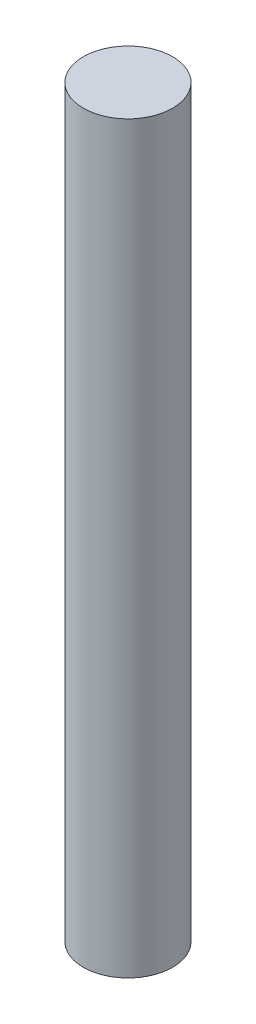
ISO-10303-21;
HEADER;
FILE_DESCRIPTION(('STEP AP214'),'2;1');
FILE_NAME('part.step','',(''),(''),'','','');
FILE_SCHEMA(('AUTOMOTIVE_DESIGN { 1 0 10303 214 1 1 1 1 }'));
ENDSEC;
DATA;
#1=APPLICATION_CONTEXT('core data for automotive mechanical design processes');
#2=APPLICATION_PROTOCOL_DEFINITION('international standard','automotive_design',2000,#1);
#3=PRODUCT_CONTEXT('',#1,'mechanical');
#4=PRODUCT('Part','Part','',(#3));
#5=PRODUCT_RELATED_PRODUCT_CATEGORY('part','',(#4));
#6=PRODUCT_DEFINITION_FORMATION('','',#4);
#7=PRODUCT_DEFINITION_CONTEXT('part definition',#1,'design');
#8=PRODUCT_DEFINITION('design','',#6,#7);
#9=PRODUCT_DEFINITION_SHAPE('','',#8);
#10=(LENGTH_UNIT() NAMED_UNIT(*) SI_UNIT(.MILLI.,.METRE.));
#11=(NAMED_UNIT(*) PLANE_ANGLE_UNIT() SI_UNIT($,.RADIAN.));
#12=(NAMED_UNIT(*) SI_UNIT($,.STERADIAN.) SOLID_ANGLE_UNIT());
#13=UNCERTAINTY_MEASURE_WITH_UNIT(LENGTH_MEASURE(1.E-05),#10,'distance_accuracy_value','');
#14=(GEOMETRIC_REPRESENTATION_CONTEXT(3) GLOBAL_UNCERTAINTY_ASSIGNED_CONTEXT((#13)) GLOBAL_UNIT_ASSIGNED_CONTEXT((#10,
#11,#12)) REPRESENTATION_CONTEXT('',''));
#15=CARTESIAN_POINT('',(0.,0.,0.));
#16=DIRECTION('',(0.,0.,1.));
#17=DIRECTION('',(1.,0.,0.));
#18=AXIS2_PLACEMENT_3D('',#15,#16,#17);
#19=CARTESIAN_POINT('',(-3.13988527975147,10.,1.62340401937721));
#20=DIRECTION('',(0.,-1.,0.));
#21=DIRECTION('',(0.,0.,-1.));
#22=AXIS2_PLACEMENT_3D('',#19,#20,#21);
#23=CYLINDRICAL_SURFACE('',#22,0.6);
#24=CARTESIAN_POINT('',(-3.13988527975147,10.,1.62340401937721));
#25=DIRECTION('',(0.,1.,0.));
#26=DIRECTION('',(0.,0.,1.));
#27=AXIS2_PLACEMENT_3D('',#24,#25,#26);
#28=CIRCLE('',#27,0.6);
#29=CARTESIAN_POINT('',(-3.13988527975147,10.,2.22340401937721));
#30=VERTEX_POINT('',#29);
#31=EDGE_CURVE('E10',#30,#30,#28,.T.);
#32=ORIENTED_EDGE('',*,*,#31,.F.);
#33=EDGE_LOOP('',(#32));
#34=FACE_BOUND('',#33,.T.);
#35=CARTESIAN_POINT('',(-3.13988527975147,0.,1.62340401937721));
#36=DIRECTION('',(0.,1.,0.));
#37=DIRECTION('',(0.,0.,1.));
#38=AXIS2_PLACEMENT_3D('',#35,#36,#37);
#39=CIRCLE('',#38,0.6);
#40=CARTESIAN_POINT('',(-3.13988527975147,0.,2.22340401937721));
#41=VERTEX_POINT('',#40);
#42=EDGE_CURVE('E36',#41,#41,#39,.T.);
#43=ORIENTED_EDGE('',*,*,#42,.T.);
#44=EDGE_LOOP('',(#43));
#45=FACE_BOUND('',#44,.T.);
#46=ADVANCED_FACE('F33',(#34,#45),#23,.T.);
#47=CARTESIAN_POINT('',(-3.13988527975147,10.,1.62340401937721));
#48=DIRECTION('',(0.,1.,0.));
#49=DIRECTION('',(0.,0.,1.));
#50=AXIS2_PLACEMENT_3D('',#47,#48,#49);
#51=PLANE('',#50);
#52=ORIENTED_EDGE('',*,*,#31,.T.);
#53=EDGE_LOOP('',(#52));
#54=FACE_BOUND('',#53,.T.);
#55=ADVANCED_FACE('F48',(#54),#51,.T.);
#56=CARTESIAN_POINT('',(-3.13988527975147,0.,1.62340401937721));
#57=DIRECTION('',(0.,1.,0.));
#58=DIRECTION('',(0.,0.,1.));
#59=AXIS2_PLACEMENT_3D('',#56,#57,#58);
#60=PLANE('',#59);
#61=ORIENTED_EDGE('',*,*,#42,.F.);
#62=EDGE_LOOP('',(#61));
#63=FACE_BOUND('',#62,.T.);
#64=ADVANCED_FACE('F46',(#63),#60,.F.);
#65=CLOSED_SHELL('',(#46,#55,#64));
#66=MANIFOLD_SOLID_BREP('B2',#65);
#67=ADVANCED_BREP_SHAPE_REPRESENTATION('',(#18,#66),#14);
#68=SHAPE_DEFINITION_REPRESENTATION(#9,#67);
ENDSEC;
END-ISO-10303-21;
